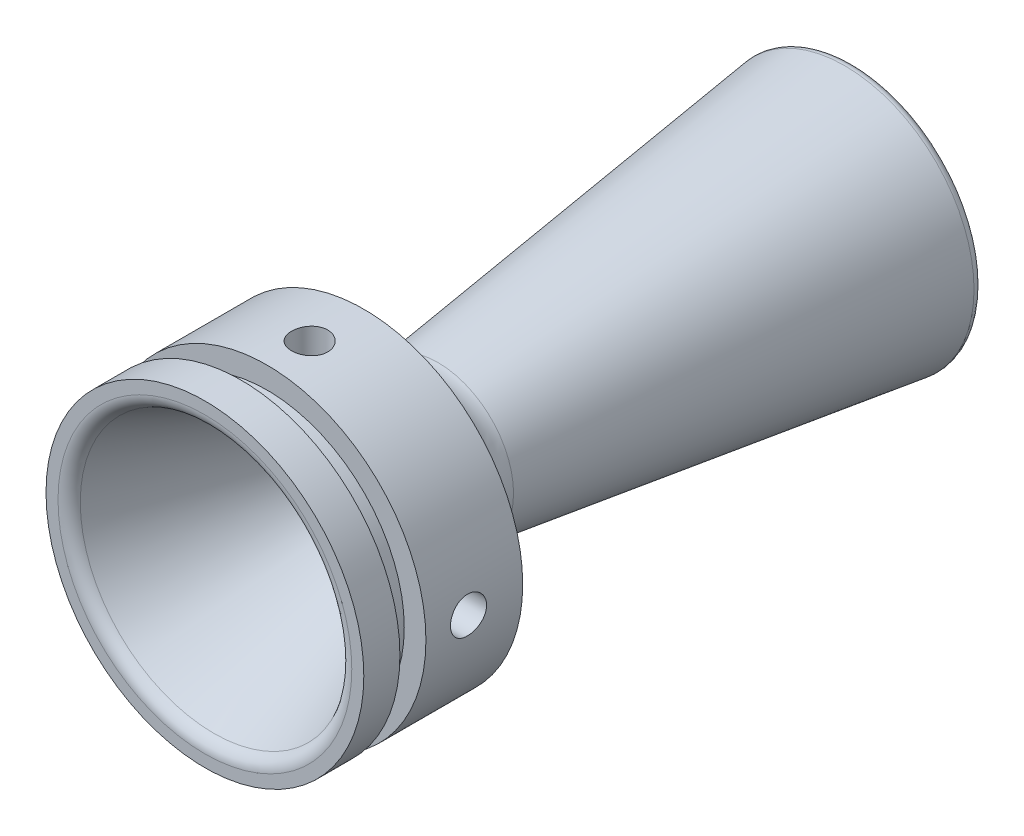
ISO-10303-21;
HEADER;
FILE_DESCRIPTION(('STEP AP214'),'2;1');
FILE_NAME('part.step','',(''),(''),'','','');
FILE_SCHEMA(('AUTOMOTIVE_DESIGN { 1 0 10303 214 1 1 1 1 }'));
ENDSEC;
DATA;
#1=APPLICATION_CONTEXT('core data for automotive mechanical design processes');
#2=APPLICATION_PROTOCOL_DEFINITION('international standard','automotive_design',2000,#1);
#3=PRODUCT_CONTEXT('',#1,'mechanical');
#4=PRODUCT('Part','Part','',(#3));
#5=PRODUCT_RELATED_PRODUCT_CATEGORY('part','',(#4));
#6=PRODUCT_DEFINITION_FORMATION('','',#4);
#7=PRODUCT_DEFINITION_CONTEXT('part definition',#1,'design');
#8=PRODUCT_DEFINITION('design','',#6,#7);
#9=PRODUCT_DEFINITION_SHAPE('','',#8);
#10=(LENGTH_UNIT() NAMED_UNIT(*) SI_UNIT(.MILLI.,.METRE.));
#11=(NAMED_UNIT(*) PLANE_ANGLE_UNIT() SI_UNIT($,.RADIAN.));
#12=(NAMED_UNIT(*) SI_UNIT($,.STERADIAN.) SOLID_ANGLE_UNIT());
#13=UNCERTAINTY_MEASURE_WITH_UNIT(LENGTH_MEASURE(1.E-05),#10,'distance_accuracy_value','');
#14=(GEOMETRIC_REPRESENTATION_CONTEXT(3) GLOBAL_UNCERTAINTY_ASSIGNED_CONTEXT((#13)) GLOBAL_UNIT_ASSIGNED_CONTEXT((#10,
#11,#12)) REPRESENTATION_CONTEXT('',''));
#15=CARTESIAN_POINT('',(0.,0.,0.));
#16=DIRECTION('',(0.,0.,1.));
#17=DIRECTION('',(1.,0.,0.));
#18=AXIS2_PLACEMENT_3D('',#15,#16,#17);
#19=CARTESIAN_POINT('',(0.,0.,41.444538182155));
#20=DIRECTION('',(0.,0.,1.));
#21=DIRECTION('',(1.,0.,0.));
#22=AXIS2_PLACEMENT_3D('',#19,#20,#21);
#23=CONICAL_SURFACE('',#22,19.,0.392699081698717);
#24=CARTESIAN_POINT('',(0.,0.,40.2099050468852));
#25=DIRECTION('',(0.,0.,-1.));
#26=DIRECTION('',(-1.,0.,0.));
#27=AXIS2_PLACEMENT_3D('',#24,#25,#26);
#28=CIRCLE('',#27,18.488598210816);
#29=CARTESIAN_POINT('',(-18.488598210816,0.,40.2099050468852));
#30=VERTEX_POINT('',#29);
#31=EDGE_CURVE('E47',#30,#30,#28,.F.);
#32=ORIENTED_EDGE('',*,*,#31,.T.);
#33=EDGE_LOOP('',(#32));
#34=FACE_BOUND('',#33,.T.);
#35=CARTESIAN_POINT('',(0.,0.,12.7215282083173));
#36=DIRECTION('',(0.,0.,-1.));
#37=DIRECTION('',(-1.,0.,0.));
#38=AXIS2_PLACEMENT_3D('',#35,#36,#37);
#39=CIRCLE('',#38,7.10253971665899);
#40=CARTESIAN_POINT('',(-7.10253971665899,0.,12.7215282083173));
#41=VERTEX_POINT('',#40);
#42=EDGE_CURVE('E128',#41,#41,#39,.T.);
#43=ORIENTED_EDGE('',*,*,#42,.T.);
#44=EDGE_LOOP('',(#43));
#45=FACE_BOUND('',#44,.T.);
#46=ADVANCED_FACE('F40',(#34,#45),#23,.F.);
#47=CARTESIAN_POINT('',(0.,0.,12.4739754336773));
#48=DIRECTION('',(0.,0.,-1.));
#49=DIRECTION('',(-1.,0.,0.));
#50=AXIS2_PLACEMENT_3D('',#47,#48,#49);
#51=CONICAL_SURFACE('',#50,7.,0.130899693899576);
#52=CARTESIAN_POINT('',(0.,0.,-47.4225836603435));
#53=DIRECTION('',(0.,0.,1.));
#54=DIRECTION('',(1.,0.,0.));
#55=AXIS2_PLACEMENT_3D('',#52,#53,#54);
#56=CIRCLE('',#55,14.8855316016189);
#57=CARTESIAN_POINT('',(14.8855316016189,0.,-47.4225836603435));
#58=VERTEX_POINT('',#57);
#59=EDGE_CURVE('E55',#58,#58,#56,.F.);
#60=ORIENTED_EDGE('',*,*,#59,.T.);
#61=EDGE_LOOP('',(#60));
#62=FACE_BOUND('',#61,.T.);
#63=CARTESIAN_POINT('',(0.,0.,12.2083185837322));
#64=DIRECTION('',(0.,0.,1.));
#65=DIRECTION('',(1.,0.,0.));
#66=AXIS2_PLACEMENT_3D('',#63,#64,#65);
#67=CIRCLE('',#66,7.03497438779647);
#68=CARTESIAN_POINT('',(7.03497438779647,0.,12.2083185837322));
#69=VERTEX_POINT('',#68);
#70=EDGE_CURVE('E207',#69,#69,#67,.T.);
#71=ORIENTED_EDGE('',*,*,#70,.T.);
#72=EDGE_LOOP('',(#71));
#73=FACE_BOUND('',#72,.T.);
#74=ADVANCED_FACE('F161',(#62,#73),#51,.F.);
#75=CARTESIAN_POINT('',(-15.,0.,-48.2920574681234));
#76=DIRECTION('',(0.,0.,1.));
#77=DIRECTION('',(1.,0.,0.));
#78=AXIS2_PLACEMENT_3D('',#75,#76,#77);
#79=PLANE('',#78);
#80=CARTESIAN_POINT('',(0.,0.,-48.2920574681234));
#81=DIRECTION('',(0.,0.,1.));
#82=DIRECTION('',(1.,0.,0.));
#83=AXIS2_PLACEMENT_3D('',#80,#81,#82);
#84=CIRCLE('',#83,15.8769764629928);
#85=CARTESIAN_POINT('',(15.8769764629928,0.,-48.2920574681234));
#86=VERTEX_POINT('',#85);
#87=EDGE_CURVE('E60',#86,#86,#84,.T.);
#88=ORIENTED_EDGE('',*,*,#87,.T.);
#89=EDGE_LOOP('',(#88));
#90=FACE_BOUND('',#89,.T.);
#91=CARTESIAN_POINT('',(0.,0.,-48.2920574681234));
#92=DIRECTION('',(0.,0.,1.));
#93=DIRECTION('',(1.,0.,0.));
#94=AXIS2_PLACEMENT_3D('',#91,#92,#93);
#95=CIRCLE('',#94,16.8856054235729);
#96=CARTESIAN_POINT('',(16.8856054235729,0.,-48.2920574681234));
#97=VERTEX_POINT('',#96);
#98=EDGE_CURVE('E63',#97,#97,#95,.F.);
#99=ORIENTED_EDGE('',*,*,#98,.T.);
#100=EDGE_LOOP('',(#99));
#101=FACE_BOUND('',#100,.T.);
#102=ADVANCED_FACE('F166',(#90,#101),#79,.F.);
#103=CARTESIAN_POINT('',(0.,0.,-48.2920574681234));
#104=DIRECTION('',(0.,0.,-1.));
#105=DIRECTION('',(-1.,0.,0.));
#106=AXIS2_PLACEMENT_3D('',#103,#104,#105);
#107=CONICAL_SURFACE('',#106,18.0258868817405,0.130899693899576);
#108=CARTESIAN_POINT('',(0.,0.,-47.1615312759034));
#109=DIRECTION('',(0.,0.,1.));
#110=DIRECTION('',(1.,0.,0.));
#111=AXIS2_PLACEMENT_3D('',#108,#109,#110);
#112=CIRCLE('',#111,17.8770502849467);
#113=CARTESIAN_POINT('',(17.8770502849467,0.,-47.1615312759034));
#114=VERTEX_POINT('',#113);
#115=EDGE_CURVE('E51',#114,#114,#112,.T.);
#116=ORIENTED_EDGE('',*,*,#115,.T.);
#117=EDGE_LOOP('',(#116));
#118=FACE_BOUND('',#117,.T.);
#119=CARTESIAN_POINT('',(0.,0.,9.17449056678364));
#120=DIRECTION('',(0.,0.,-1.));
#121=DIRECTION('',(-1.,0.,0.));
#122=AXIS2_PLACEMENT_3D('',#119,#120,#121);
#123=CIRCLE('',#122,10.4602723052188);
#124=CARTESIAN_POINT('',(-10.4602723052188,0.,9.17449056678364));
#125=VERTEX_POINT('',#124);
#126=EDGE_CURVE('E66',#125,#125,#123,.T.);
#127=ORIENTED_EDGE('',*,*,#126,.T.);
#128=EDGE_LOOP('',(#127));
#129=FACE_BOUND('',#128,.T.);
#130=ADVANCED_FACE('F193',(#118,#129),#107,.T.);
#131=CARTESIAN_POINT('',(0.,0.,12.4739754336773));
#132=DIRECTION('',(0.,0.,1.));
#133=DIRECTION('',(1.,0.,0.));
#134=AXIS2_PLACEMENT_3D('',#131,#132,#133);
#135=CONICAL_SURFACE('',#134,10.0258868817405,1.04361566397622);
#136=CARTESIAN_POINT('',(0.,0.,14.1482660703498));
#137=DIRECTION('',(0.,0.,1.));
#138=DIRECTION('',(1.,0.,0.));
#139=AXIS2_PLACEMENT_3D('',#136,#137,#138);
#140=CIRCLE('',#139,12.9020026559995);
#141=CARTESIAN_POINT('',(12.9020026559995,0.,14.1482660703498));
#142=VERTEX_POINT('',#141);
#143=EDGE_CURVE('E69',#142,#142,#140,.T.);
#144=ORIENTED_EDGE('',*,*,#143,.T.);
#145=EDGE_LOOP('',(#144));
#146=FACE_BOUND('',#145,.T.);
#147=CARTESIAN_POINT('',(0.,0.,19.444538182155));
#148=DIRECTION('',(0.,0.,1.));
#149=DIRECTION('',(1.,0.,0.));
#150=AXIS2_PLACEMENT_3D('',#147,#148,#149);
#151=CIRCLE('',#150,22.);
#152=CARTESIAN_POINT('',(22.,0.,19.444538182155));
#153=VERTEX_POINT('',#152);
#154=EDGE_CURVE('E205',#153,#153,#151,.T.);
#155=ORIENTED_EDGE('',*,*,#154,.F.);
#156=EDGE_LOOP('',(#155));
#157=FACE_BOUND('',#156,.T.);
#158=ADVANCED_FACE('F156',(#146,#157),#135,.T.);
#159=CARTESIAN_POINT('',(0.,0.,0.));
#160=DIRECTION('',(0.,0.,1.));
#161=DIRECTION('',(1.,0.,0.));
#162=AXIS2_PLACEMENT_3D('',#159,#160,#161);
#163=CYLINDRICAL_SURFACE('',#162,22.);
#164=CARTESIAN_POINT('',(-21.8574929943944,-2.50000000000023,26.944538182155));
#165=CARTESIAN_POINT('',(-21.8574948404449,-2.49999399345875,26.8045993506711));
#166=CARTESIAN_POINT('',(-21.8588513925992,-2.48821066246475,26.6645706120558));
#167=CARTESIAN_POINT('',(-21.864129607938,-2.44138692557921,26.3884030757904));
#168=CARTESIAN_POINT('',(-21.8680540220547,-2.40632157723589,26.2522686134783));
#169=CARTESIAN_POINT('',(-21.8780178338977,-2.31397472598975,25.9879284868806));
#170=CARTESIAN_POINT('',(-21.8840558698382,-2.2567075249758,25.8597177798252));
#171=CARTESIAN_POINT('',(-21.8975649360899,-2.12161174348122,25.6147529474055));
#172=CARTESIAN_POINT('',(-21.9050357023158,-2.0437869512451,25.4979967167015));
#173=CARTESIAN_POINT('',(-21.9206073815676,-1.86939694811628,25.2786863408821));
#174=CARTESIAN_POINT('',(-21.928710779348,-1.77275535863444,25.1761931001405));
#175=CARTESIAN_POINT('',(-21.9446122373921,-1.56363902487904,24.988843452653));
#176=CARTESIAN_POINT('',(-21.9524102830485,-1.45116352433197,24.9039878888132));
#177=CARTESIAN_POINT('',(-21.9668474759571,-1.21319341197233,24.7541072352822));
#178=CARTESIAN_POINT('',(-21.9734834111379,-1.08766419785685,24.6891367490087));
#179=CARTESIAN_POINT('',(-21.9848214978184,-0.827389205168524,24.5812200455874));
#180=CARTESIAN_POINT('',(-21.9895237091853,-0.692643712077801,24.53827314659));
#181=CARTESIAN_POINT('',(-21.9964470600792,-0.418381005212754,24.4758032739701));
#182=CARTESIAN_POINT('',(-21.998678870315,-0.278887017845019,24.4561795304337));
#183=CARTESIAN_POINT('',(-22.0004463272971,0.00143099383586754,24.4406009537405));
#184=CARTESIAN_POINT('',(-21.9999820627129,0.142254974255643,24.4446453421775));
#185=CARTESIAN_POINT('',(-21.9964183604366,0.420550630608937,24.4762069673103));
#186=CARTESIAN_POINT('',(-21.9933310886017,0.558034773962368,24.503615838368));
#187=CARTESIAN_POINT('',(-21.9848820663586,0.826439024849395,24.5809592718644));
#188=CARTESIAN_POINT('',(-21.979520279177,0.957359026218432,24.6308941984957));
#189=CARTESIAN_POINT('',(-21.9671038779958,1.20925707942373,24.7519892325637));
#190=CARTESIAN_POINT('',(-21.9600454901808,1.33021214895033,24.8231967444282));
#191=CARTESIAN_POINT('',(-21.9450267053126,1.55849612951545,24.9847811792607));
#192=CARTESIAN_POINT('',(-21.9370662740678,1.665824523714,25.0751588289772));
#193=CARTESIAN_POINT('',(-21.9210823776639,1.86444422114993,25.2731262109408));
#194=CARTESIAN_POINT('',(-21.9130588104756,1.95564149146887,25.3808103037116));
#195=CARTESIAN_POINT('',(-21.8978975645861,2.11868072453664,25.6100082252495));
#196=CARTESIAN_POINT('',(-21.8907598878654,2.1905226440133,25.7315220849345));
#197=CARTESIAN_POINT('',(-21.8781783612793,2.31281440255516,25.9850084349154));
#198=CARTESIAN_POINT('',(-21.8727350420934,2.36325754122656,26.1169841857123));
#199=CARTESIAN_POINT('',(-21.864169235206,2.44124079586617,26.3876082570546));
#200=CARTESIAN_POINT('',(-21.8610466556216,2.46878181857982,26.5262563131986));
#201=CARTESIAN_POINT('',(-21.8574922979508,2.50005624703237,26.8054611995133));
#202=CARTESIAN_POINT('',(-21.8570456061295,2.50392160890486,26.9460030665531));
#203=CARTESIAN_POINT('',(-21.8588542040416,2.48808238007229,27.2257324105612));
#204=CARTESIAN_POINT('',(-21.8611094463909,2.46837820270987,27.3649199112382));
#205=CARTESIAN_POINT('',(-21.8680542187961,2.40606999333129,27.6375992785569));
#206=CARTESIAN_POINT('',(-21.8727370324259,2.36352913269651,27.7711057658216));
#207=CARTESIAN_POINT('',(-21.8840038747199,2.25681990269816,28.0290893261476));
#208=CARTESIAN_POINT('',(-21.8905879590963,2.19265089956366,28.1535661344816));
#209=CARTESIAN_POINT('',(-21.9049514016359,2.04417952250898,28.3905560578221));
#210=CARTESIAN_POINT('',(-21.9127358698692,1.9597901768422,28.5030143714151));
#211=CARTESIAN_POINT('',(-21.9286066123765,1.77339738422291,28.7122175265375));
#212=CARTESIAN_POINT('',(-21.9366928963156,1.67139337281517,28.8089618643259));
#213=CARTESIAN_POINT('',(-21.9523015976726,1.4520922366466,28.9844503034995));
#214=CARTESIAN_POINT('',(-21.9598211974455,1.33472573746585,29.0631079963449));
#215=CARTESIAN_POINT('',(-21.9734077022891,1.08837113446317,29.1995940434525));
#216=CARTESIAN_POINT('',(-21.9794746322096,0.959383229491211,29.2574227540279));
#217=CARTESIAN_POINT('',(-21.9894596182653,0.693741398540139,29.3504648026428));
#218=CARTESIAN_POINT('',(-21.9933825191578,0.557105531606551,29.3857291593189));
#219=CARTESIAN_POINT('',(-21.9986574531947,0.279804901301133,29.4328077157782));
#220=CARTESIAN_POINT('',(-22.0000095811711,0.139140286737976,29.4446227805708));
#221=CARTESIAN_POINT('',(-21.9999903687085,-0.141378798478945,29.4444531442793));
#222=CARTESIAN_POINT('',(-21.9986343240669,-0.281233370030648,29.4326021096879));
#223=CARTESIAN_POINT('',(-21.9933814076815,-0.556950296258434,29.3857184301088));
#224=CARTESIAN_POINT('',(-21.9894845357215,-0.692812650594941,29.3506857831492));
#225=CARTESIAN_POINT('',(-21.9795861605335,-0.95667881692291,29.2584729850131));
#226=CARTESIAN_POINT('',(-21.9735851539652,-1.08468447503711,29.2012980599649));
#227=CARTESIAN_POINT('',(-21.9601451371913,-1.32930448780824,29.0664376068342));
#228=CARTESIAN_POINT('',(-21.9527061220459,-1.4459188033324,28.9887520082946));
#229=CARTESIAN_POINT('',(-21.9371717011071,-1.66513009568999,28.814577199868));
#230=CARTESIAN_POINT('',(-21.9290729575937,-1.76764770962287,28.717988399767));
#231=CARTESIAN_POINT('',(-21.913159404769,-1.9550746138903,28.5089523269637));
#232=CARTESIAN_POINT('',(-21.9053446635564,-2.03997970373623,28.3965012819229));
#233=CARTESIAN_POINT('',(-21.8908571504647,-2.18999746444617,28.1585258330524));
#234=CARTESIAN_POINT('',(-21.8841881276822,-2.25504567813444,28.0329605929084));
#235=CARTESIAN_POINT('',(-21.872791323487,-2.36304368993383,27.7726884049613));
#236=CARTESIAN_POINT('',(-21.8680613941046,-2.40601795319341,27.637991766051));
#237=CARTESIAN_POINT('',(-21.8622482818917,-2.45815239629055,27.4095608694101));
#238=CARTESIAN_POINT('',(-21.8604737120552,-2.47382322658507,27.3172774146803));
#239=CARTESIAN_POINT('',(-21.8580954549332,-2.49474900486783,27.1315220783653));
#240=CARTESIAN_POINT('',(-21.8574917607989,-2.50000401378133,27.0380502037346));
#241=CARTESIAN_POINT('',(-21.8574929943944,-2.50000000000023,26.944538182155));
#242=B_SPLINE_CURVE_WITH_KNOTS('',3,(#164,#165,#166,#167,#168,#169,#170,#171,#172,#173,#174,
#175,#176,#177,#178,#179,#180,#181,#182,#183,#184,#185,#186,#187,#188,#189,#190,#191,#192,#193,
#194,#195,#196,#197,#198,#199,#200,#201,#202,#203,#204,#205,#206,#207,#208,#209,#210,#211,#212,
#213,#214,#215,#216,#217,#218,#219,#220,#221,#222,#223,#224,#225,#226,#227,#228,#229,#230,#231,
#232,#233,#234,#235,#236,#237,#238,#239,#240,#241),.UNSPECIFIED.,.T.,.F.,(4,2,2,2,2,2,2,2,2,2,2,
2,2,2,2,2,2,2,2,2,2,2,2,2,2,2,2,2,2,2,2,2,2,2,2,2,2,2,4),(0.,0.419474942050651,
0.839400001964435,1.25905500472157,1.67863272954998,2.09995045417845,2.52128830899466,
2.94377296547458,3.36624454105267,3.78688407436451,4.20750977360757,4.62619513856898,
5.04488727291757,5.46451948216004,5.88416760269032,6.30618666610461,6.72820667300605,
7.15035872559825,7.57249406346057,7.99227447605665,8.41204752700673,8.83066533056146,
9.24929540196869,9.66975947150893,10.0902370171605,10.512683476394,10.93512270866,
11.3566033870119,11.7780685172817,12.1971599385153,12.6162513953965,13.0352439964974,
13.4542380369162,13.8755020164552,14.2968663498818,14.7195842705661,15.1418326652607,
15.4221421323578,15.7024499598362),.UNSPECIFIED.);
#243=CARTESIAN_POINT('',(-21.8574929943944,-2.50000000000023,26.944538182155));
#244=VERTEX_POINT('',#243);
#245=EDGE_CURVE('E72',#244,#244,#242,.T.);
#246=ORIENTED_EDGE('',*,*,#245,.T.);
#247=EDGE_LOOP('',(#246));
#248=FACE_BOUND('',#247,.T.);
#249=CARTESIAN_POINT('',(2.50000000000015,-21.8574929943944,26.944538182155));
#250=CARTESIAN_POINT('',(2.49999399345868,-21.8574948404449,26.8045993506711));
#251=CARTESIAN_POINT('',(2.48821066246468,-21.8588513925992,26.6645706120558));
#252=CARTESIAN_POINT('',(2.44138692557914,-21.864129607938,26.3884030757904));
#253=CARTESIAN_POINT('',(2.40632157723582,-21.8680540220547,26.2522686134783));
#254=CARTESIAN_POINT('',(2.31397472598968,-21.8780178338977,25.9879284868806));
#255=CARTESIAN_POINT('',(2.25670752497572,-21.8840558698382,25.8597177798252));
#256=CARTESIAN_POINT('',(2.12161174348115,-21.89756493609,25.6147529474055));
#257=CARTESIAN_POINT('',(2.04378695124502,-21.9050357023158,25.4979967167015));
#258=CARTESIAN_POINT('',(1.8693969481162,-21.9206073815676,25.2786863408821));
#259=CARTESIAN_POINT('',(1.77275535863437,-21.928710779348,25.1761931001405));
#260=CARTESIAN_POINT('',(1.56363902487896,-21.9446122373921,24.988843452653));
#261=CARTESIAN_POINT('',(1.45116352433189,-21.9524102830485,24.9039878888132));
#262=CARTESIAN_POINT('',(1.21319341197225,-21.9668474759571,24.7541072352822));
#263=CARTESIAN_POINT('',(1.08766419785677,-21.9734834111379,24.6891367490087));
#264=CARTESIAN_POINT('',(0.827389205168447,-21.9848214978184,24.5812200455874));
#265=CARTESIAN_POINT('',(0.692643712077725,-21.9895237091853,24.53827314659));
#266=CARTESIAN_POINT('',(0.418381005212677,-21.9964470600792,24.4758032739701));
#267=CARTESIAN_POINT('',(0.278887017844942,-21.998678870315,24.4561795304337));
#268=CARTESIAN_POINT('',(-0.00143099383594379,-22.0004463272971,24.4406009537405));
#269=CARTESIAN_POINT('',(-0.142254974255719,-21.9999820627129,24.4446453421775));
#270=CARTESIAN_POINT('',(-0.420550630609013,-21.9964183604366,24.4762069673103));
#271=CARTESIAN_POINT('',(-0.558034773962445,-21.9933310886017,24.503615838368));
#272=CARTESIAN_POINT('',(-0.826439024849473,-21.9848820663586,24.5809592718644));
#273=CARTESIAN_POINT('',(-0.957359026218508,-21.979520279177,24.6308941984957));
#274=CARTESIAN_POINT('',(-1.20925707942381,-21.9671038779958,24.7519892325637));
#275=CARTESIAN_POINT('',(-1.3302121489504,-21.9600454901808,24.8231967444282));
#276=CARTESIAN_POINT('',(-1.55849612951553,-21.9450267053126,24.9847811792607));
#277=CARTESIAN_POINT('',(-1.66582452371408,-21.9370662740678,25.0751588289772));
#278=CARTESIAN_POINT('',(-1.86444422115,-21.9210823776639,25.2731262109408));
#279=CARTESIAN_POINT('',(-1.95564149146895,-21.9130588104756,25.3808103037116));
#280=CARTESIAN_POINT('',(-2.11868072453671,-21.8978975645861,25.6100082252495));
#281=CARTESIAN_POINT('',(-2.19052264401337,-21.8907598878654,25.7315220849345));
#282=CARTESIAN_POINT('',(-2.31281440255523,-21.8781783612793,25.9850084349154));
#283=CARTESIAN_POINT('',(-2.36325754122664,-21.8727350420934,26.1169841857123));
#284=CARTESIAN_POINT('',(-2.44124079586624,-21.8641692352059,26.3876082570546));
#285=CARTESIAN_POINT('',(-2.4687818185799,-21.8610466556216,26.5262563131986));
#286=CARTESIAN_POINT('',(-2.50005624703245,-21.8574922979508,26.8054611995133));
#287=CARTESIAN_POINT('',(-2.50392160890494,-21.8570456061295,26.9460030665531));
#288=CARTESIAN_POINT('',(-2.48808238007237,-21.8588542040416,27.2257324105612));
#289=CARTESIAN_POINT('',(-2.46837820270995,-21.8611094463909,27.3649199112382));
#290=CARTESIAN_POINT('',(-2.40606999333136,-21.8680542187961,27.6375992785569));
#291=CARTESIAN_POINT('',(-2.36352913269659,-21.8727370324259,27.7711057658216));
#292=CARTESIAN_POINT('',(-2.25681990269824,-21.8840038747199,28.0290893261476));
#293=CARTESIAN_POINT('',(-2.19265089956374,-21.8905879590963,28.1535661344816));
#294=CARTESIAN_POINT('',(-2.04417952250905,-21.9049514016359,28.3905560578221));
#295=CARTESIAN_POINT('',(-1.95979017684228,-21.9127358698691,28.5030143714151));
#296=CARTESIAN_POINT('',(-1.77339738422299,-21.9286066123765,28.7122175265375));
#297=CARTESIAN_POINT('',(-1.67139337281524,-21.9366928963156,28.8089618643259));
#298=CARTESIAN_POINT('',(-1.45209223664668,-21.9523015976726,28.9844503034995));
#299=CARTESIAN_POINT('',(-1.33472573746593,-21.9598211974455,29.0631079963449));
#300=CARTESIAN_POINT('',(-1.08837113446325,-21.9734077022891,29.1995940434525));
#301=CARTESIAN_POINT('',(-0.959383229491288,-21.9794746322096,29.2574227540279));
#302=CARTESIAN_POINT('',(-0.693741398540216,-21.9894596182653,29.3504648026428));
#303=CARTESIAN_POINT('',(-0.557105531606628,-21.9933825191578,29.3857291593189));
#304=CARTESIAN_POINT('',(-0.27980490130121,-21.9986574531947,29.4328077157782));
#305=CARTESIAN_POINT('',(-0.139140286738053,-22.0000095811711,29.4446227805708));
#306=CARTESIAN_POINT('',(0.141378798478868,-21.9999903687085,29.4444531442793));
#307=CARTESIAN_POINT('',(0.281233370030571,-21.9986343240669,29.4326021096879));
#308=CARTESIAN_POINT('',(0.556950296258358,-21.9933814076815,29.3857184301088));
#309=CARTESIAN_POINT('',(0.692812650594865,-21.9894845357215,29.3506857831492));
#310=CARTESIAN_POINT('',(0.956678816922833,-21.9795861605335,29.2584729850131));
#311=CARTESIAN_POINT('',(1.08468447503703,-21.9735851539652,29.2012980599649));
#312=CARTESIAN_POINT('',(1.32930448780816,-21.9601451371913,29.0664376068342));
#313=CARTESIAN_POINT('',(1.44591880333232,-21.9527061220459,28.9887520082946));
#314=CARTESIAN_POINT('',(1.66513009568991,-21.9371717011071,28.814577199868));
#315=CARTESIAN_POINT('',(1.76764770962279,-21.9290729575937,28.717988399767));
#316=CARTESIAN_POINT('',(1.95507461389022,-21.913159404769,28.5089523269637));
#317=CARTESIAN_POINT('',(2.03997970373615,-21.9053446635565,28.3965012819229));
#318=CARTESIAN_POINT('',(2.18999746444609,-21.8908571504647,28.1585258330524));
#319=CARTESIAN_POINT('',(2.25504567813436,-21.8841881276823,28.0329605929084));
#320=CARTESIAN_POINT('',(2.36304368993375,-21.872791323487,27.7726884049613));
#321=CARTESIAN_POINT('',(2.40601795319333,-21.8680613941046,27.637991766051));
#322=CARTESIAN_POINT('',(2.45815239629047,-21.8622482818917,27.4095608694101));
#323=CARTESIAN_POINT('',(2.47382322658499,-21.8604737120552,27.3172774146803));
#324=CARTESIAN_POINT('',(2.49474900486776,-21.8580954549332,27.1315220783653));
#325=CARTESIAN_POINT('',(2.50000401378125,-21.8574917607989,27.0380502037346));
#326=CARTESIAN_POINT('',(2.50000000000015,-21.8574929943944,26.944538182155));
#327=B_SPLINE_CURVE_WITH_KNOTS('',3,(#249,#250,#251,#252,#253,#254,#255,#256,#257,#258,#259,
#260,#261,#262,#263,#264,#265,#266,#267,#268,#269,#270,#271,#272,#273,#274,#275,#276,#277,#278,
#279,#280,#281,#282,#283,#284,#285,#286,#287,#288,#289,#290,#291,#292,#293,#294,#295,#296,#297,
#298,#299,#300,#301,#302,#303,#304,#305,#306,#307,#308,#309,#310,#311,#312,#313,#314,#315,#316,
#317,#318,#319,#320,#321,#322,#323,#324,#325,#326),.UNSPECIFIED.,.T.,.F.,(4,2,2,2,2,2,2,2,2,2,2,
2,2,2,2,2,2,2,2,2,2,2,2,2,2,2,2,2,2,2,2,2,2,2,2,2,2,2,4),(0.,0.419474942050651,
0.839400001964435,1.25905500472157,1.67863272954998,2.09995045417845,2.52128830899466,
2.94377296547458,3.36624454105267,3.78688407436451,4.20750977360757,4.62619513856898,
5.04488727291757,5.46451948216004,5.88416760269032,6.30618666610461,6.72820667300604,
7.15035872559824,7.57249406346057,7.99227447605665,8.41204752700673,8.83066533056146,
9.24929540196869,9.66975947150892,10.0902370171605,10.512683476394,10.93512270866,
11.3566033870119,11.7780685172817,12.1971599385153,12.6162513953965,13.0352439964974,
13.4542380369162,13.8755020164552,14.2968663498818,14.719584270566,15.1418326652607,
15.4221421323578,15.7024499598362),.UNSPECIFIED.);
#328=CARTESIAN_POINT('',(2.50000000000015,-21.8574929943944,26.944538182155));
#329=VERTEX_POINT('',#328);
#330=EDGE_CURVE('E80',#329,#329,#327,.T.);
#331=ORIENTED_EDGE('',*,*,#330,.T.);
#332=EDGE_LOOP('',(#331));
#333=FACE_BOUND('',#332,.T.);
#334=CARTESIAN_POINT('',(22.,0.,24.444538182155));
#335=CARTESIAN_POINT('',(21.9999981975919,-0.139942120492704,24.4445441857788));
#336=CARTESIAN_POINT('',(21.9986505974093,-0.279974138126226,24.4563280519622));
#337=CARTESIAN_POINT('',(21.9934043565321,-0.556148487010532,24.5031541078237));
#338=CARTESIAN_POINT('',(21.9895029814005,-0.692286485506178,24.5382212284647));
#339=CARTESIAN_POINT('',(21.9795891281265,-0.956634090603118,24.6305732638718));
#340=CARTESIAN_POINT('',(21.9735780011658,-1.084848710035,24.6878439609011));
#341=CARTESIAN_POINT('',(21.9601149294206,-1.32982010232701,24.8229479761752));
#342=CARTESIAN_POINT('',(21.9526632507436,-1.44657898536496,24.9007774976395));
#343=CARTESIAN_POINT('',(21.9371141432161,-1.66588638440345,25.0751722856485));
#344=CARTESIAN_POINT('',(21.9290141980917,-1.76837483182788,25.171812873508));
#345=CARTESIAN_POINT('',(21.9131020063762,-1.95571522291826,25.3809251889752));
#346=CARTESIAN_POINT('',(21.9052897737902,-2.04056630896765,25.4933976859636));
#347=CARTESIAN_POINT('',(21.8908124112617,-2.19044226566766,25.7313651486069));
#348=CARTESIAN_POINT('',(21.8841505100655,-2.25541171448298,25.8568952331857));
#349=CARTESIAN_POINT('',(21.8727604817688,-2.36332625999539,26.1171721172543));
#350=CARTESIAN_POINT('',(21.8680322937344,-2.40627205069835,26.2519186261659));
#351=CARTESIAN_POINT('',(21.8610685551783,-2.46873962870037,26.5261845165391));
#352=CARTESIAN_POINT('',(21.8588222953962,-2.48836208177004,26.6656806935126));
#353=CARTESIAN_POINT('',(21.8570437801561,-2.50393731881292,26.9460029978343));
#354=CARTESIAN_POINT('',(21.857511433825,-2.49989089531933,27.0868290804941));
#355=CARTESIAN_POINT('',(21.8610981119458,-2.46832603397922,27.365115800227));
#356=CARTESIAN_POINT('',(21.8642046638515,-2.44091801082985,27.5025891446405));
#357=CARTESIAN_POINT('',(21.8726996480669,-2.36358001078347,27.770972235963));
#358=CARTESIAN_POINT('',(21.8780881192308,-2.31364965039851,27.9018818710697));
#359=CARTESIAN_POINT('',(21.8905540526255,-2.19256410016401,28.153767302926));
#360=CARTESIAN_POINT('',(21.8976353640563,-2.12136044532622,28.2747196034879));
#361=CARTESIAN_POINT('',(21.9126859988771,-1.95978425819468,28.5029996790514));
#362=CARTESIAN_POINT('',(21.9206553558465,-1.86941100093277,28.6103269385271));
#363=CARTESIAN_POINT('',(21.9366396636115,-1.67144675226655,28.808951544202));
#364=CARTESIAN_POINT('',(21.9446546152082,-1.56376049910153,28.9001539721799));
#365=CARTESIAN_POINT('',(21.9597843300299,-1.33455641116137,29.063202584714));
#366=CARTESIAN_POINT('',(21.9668990917444,-1.21303855318131,29.1350487367959));
#367=CARTESIAN_POINT('',(21.9794301549947,-0.959551083313942,29.2573435471591));
#368=CARTESIAN_POINT('',(21.9848460278232,-0.827578843815121,29.3077868056432));
#369=CARTESIAN_POINT('',(21.9933650035466,-0.556962410192956,29.3857713742308));
#370=CARTESIAN_POINT('',(21.9964681958351,-0.418318474175985,29.4133135695502));
#371=CARTESIAN_POINT('',(22.0000006162529,-0.139115562473795,29.4445924251968));
#372=CARTESIAN_POINT('',(22.0004445432446,0.00142857438073979,29.4484599478665));
#373=CARTESIAN_POINT('',(21.9986479703045,0.281162975755555,29.4326242305211));
#374=CARTESIAN_POINT('',(21.9964075174271,0.420353263964264,29.4129214036694));
#375=CARTESIAN_POINT('',(21.9895031856979,0.693046793171793,29.3506129252209));
#376=CARTESIAN_POINT('',(21.9848458531969,0.826564347682261,29.3080691298741));
#377=CARTESIAN_POINT('',(21.9736296697858,1.08456874561861,29.2013503277328));
#378=CARTESIAN_POINT('',(21.9670707646913,1.20905533158528,29.1371747045418));
#379=CARTESIAN_POINT('',(21.9527471473237,1.44605201209458,28.9886935302187));
#380=CARTESIAN_POINT('',(21.9449773761005,1.55850835984385,28.9043026878536));
#381=CARTESIAN_POINT('',(21.9291185390767,1.76770685232021,28.7179080649365));
#382=CARTESIAN_POINT('',(21.9210294628737,1.86444848456352,28.6159037102015));
#383=CARTESIAN_POINT('',(21.9053988844009,2.03993094133513,28.3966037350238));
#384=CARTESIAN_POINT('',(21.897860121097,2.11858542899803,28.2792388051536));
#385=CARTESIAN_POINT('',(21.8842272488579,2.25506585466954,28.032888208424));
#386=CARTESIAN_POINT('',(21.8781331152983,2.31289214771193,27.9039027396933));
#387=CARTESIAN_POINT('',(21.8680974959171,2.40593262677908,27.6382594809815));
#388=CARTESIAN_POINT('',(21.8641512558184,2.44119678383576,27.5016193803227));
#389=CARTESIAN_POINT('',(21.8588440977794,2.48827350695182,27.2243098099821));
#390=CARTESIAN_POINT('',(21.8574830819732,2.50008696076006,27.0836404930346));
#391=CARTESIAN_POINT('',(21.8575029608798,2.4999125682507,26.8031240664231));
#392=CARTESIAN_POINT('',(21.8588682317912,2.48806034520334,26.6632768517682));
#393=CARTESIAN_POINT('',(21.8641533983156,2.44117687417044,26.3875749393215));
#394=CARTESIAN_POINT('',(21.8680732955693,2.40614561129916,26.2517202440938));
#395=CARTESIAN_POINT('',(21.8780214521343,2.31393853334814,25.9878696340495));
#396=CARTESIAN_POINT('',(21.8840492043727,2.25676804380298,25.8598718378475));
#397=CARTESIAN_POINT('',(21.8975348313535,2.12191890001939,25.6152657020477));
#398=CARTESIAN_POINT('',(21.9049927116226,2.04424016652735,25.4986574064668));
#399=CARTESIAN_POINT('',(21.920549528211,1.87007297620061,25.2794459241543));
#400=CARTESIAN_POINT('',(21.92865176664,1.77348335456731,25.176923344949));
#401=CARTESIAN_POINT('',(21.944554677904,1.56444358645355,24.9894868059735));
#402=CARTESIAN_POINT('',(21.9523552786678,1.45198967894404,24.9045770335897));
#403=CARTESIAN_POINT('',(21.9668026825691,1.21401183088061,24.7545541546959));
#404=CARTESIAN_POINT('',(21.9734457481365,1.08844757147553,24.6895046846524));
#405=CARTESIAN_POINT('',(21.9847906665335,0.828177449520047,24.5815040534795));
#406=CARTESIAN_POINT('',(21.9894946659339,0.693481888903993,24.5385284432648));
#407=CARTESIAN_POINT('',(21.9952742327682,0.46504739936882,24.4863902593028));
#408=CARTESIAN_POINT('',(21.9970379412664,0.37275900968676,24.4707177451453));
#409=CARTESIAN_POINT('',(21.9994014237902,0.186993790422357,24.4497897303626));
#410=CARTESIAN_POINT('',(22.0000012044675,0.0935169676348403,24.4445341702058));
#411=CARTESIAN_POINT('',(22.,0.,24.444538182155));
#412=B_SPLINE_CURVE_WITH_KNOTS('',3,(#334,#335,#336,#337,#338,#339,#340,#341,#342,#343,#344,
#345,#346,#347,#348,#349,#350,#351,#352,#353,#354,#355,#356,#357,#358,#359,#360,#361,#362,#363,
#364,#365,#366,#367,#368,#369,#370,#371,#372,#373,#374,#375,#376,#377,#378,#379,#380,#381,#382,
#383,#384,#385,#386,#387,#388,#389,#390,#391,#392,#393,#394,#395,#396,#397,#398,#399,#400,#401,
#402,#403,#404,#405,#406,#407,#408,#409,#410,#411),.UNSPECIFIED.,.T.,.F.,(4,2,2,2,2,2,2,2,2,2,2,
2,2,2,2,2,2,2,2,2,2,2,2,2,2,2,2,2,2,2,2,2,2,2,2,2,2,2,4),(0.,0.419484822149135,
0.839419541148179,1.25908580401208,1.67867461750185,2.09997941147311,2.5213046865971,
2.94379396376735,3.3662699267073,3.78691574360225,4.20754747559246,4.62620211598883,
5.04486388508897,5.46448682171935,5.88412563074592,6.30615785615299,6.72819078960325,
7.15033013572643,7.5724531637517,7.99224077372736,8.41202102537511,8.83067015104128,
9.24933120707243,9.66979077675304,10.0902640555888,10.5127045758307,10.9351378948842,
11.3566323321255,11.7781108129862,12.1971808171325,12.616251090409,13.0352206199537,
13.4541917686199,13.8754686843874,14.2968456428381,14.7195589420158,15.141803027316,
15.4221272970131,15.7024499646853),.UNSPECIFIED.);
#413=CARTESIAN_POINT('',(22.,0.,24.444538182155));
#414=VERTEX_POINT('',#413);
#415=EDGE_CURVE('E116',#414,#414,#412,.T.);
#416=ORIENTED_EDGE('',*,*,#415,.T.);
#417=EDGE_LOOP('',(#416));
#418=FACE_BOUND('',#417,.T.);
#419=CARTESIAN_POINT('',(-2.50000000000015,21.8574929943944,26.944538182155));
#420=CARTESIAN_POINT('',(-2.49999399345868,21.8574948404449,26.8045993506711));
#421=CARTESIAN_POINT('',(-2.48821066246468,21.8588513925992,26.6645706120558));
#422=CARTESIAN_POINT('',(-2.44138692557914,21.864129607938,26.3884030757904));
#423=CARTESIAN_POINT('',(-2.40632157723582,21.8680540220547,26.2522686134783));
#424=CARTESIAN_POINT('',(-2.31397472598968,21.8780178338977,25.9879284868806));
#425=CARTESIAN_POINT('',(-2.25670752497572,21.8840558698382,25.8597177798252));
#426=CARTESIAN_POINT('',(-2.12161174348115,21.89756493609,25.6147529474055));
#427=CARTESIAN_POINT('',(-2.04378695124502,21.9050357023158,25.4979967167015));
#428=CARTESIAN_POINT('',(-1.8693969481162,21.9206073815676,25.2786863408821));
#429=CARTESIAN_POINT('',(-1.77275535863437,21.928710779348,25.1761931001405));
#430=CARTESIAN_POINT('',(-1.56363902487896,21.9446122373921,24.988843452653));
#431=CARTESIAN_POINT('',(-1.45116352433189,21.9524102830485,24.9039878888132));
#432=CARTESIAN_POINT('',(-1.21319341197225,21.9668474759571,24.7541072352822));
#433=CARTESIAN_POINT('',(-1.08766419785677,21.9734834111379,24.6891367490087));
#434=CARTESIAN_POINT('',(-0.827389205168447,21.9848214978184,24.5812200455874));
#435=CARTESIAN_POINT('',(-0.692643712077725,21.9895237091853,24.53827314659));
#436=CARTESIAN_POINT('',(-0.418381005212677,21.9964470600792,24.4758032739701));
#437=CARTESIAN_POINT('',(-0.278887017844942,21.998678870315,24.4561795304337));
#438=CARTESIAN_POINT('',(0.00143099383594379,22.0004463272971,24.4406009537405));
#439=CARTESIAN_POINT('',(0.142254974255719,21.9999820627129,24.4446453421775));
#440=CARTESIAN_POINT('',(0.420550630609013,21.9964183604366,24.4762069673103));
#441=CARTESIAN_POINT('',(0.558034773962445,21.9933310886017,24.503615838368));
#442=CARTESIAN_POINT('',(0.826439024849473,21.9848820663586,24.5809592718644));
#443=CARTESIAN_POINT('',(0.957359026218508,21.979520279177,24.6308941984957));
#444=CARTESIAN_POINT('',(1.20925707942381,21.9671038779958,24.7519892325637));
#445=CARTESIAN_POINT('',(1.3302121489504,21.9600454901808,24.8231967444282));
#446=CARTESIAN_POINT('',(1.55849612951553,21.9450267053126,24.9847811792607));
#447=CARTESIAN_POINT('',(1.66582452371408,21.9370662740678,25.0751588289772));
#448=CARTESIAN_POINT('',(1.86444422115,21.9210823776639,25.2731262109408));
#449=CARTESIAN_POINT('',(1.95564149146895,21.9130588104756,25.3808103037116));
#450=CARTESIAN_POINT('',(2.11868072453671,21.8978975645861,25.6100082252495));
#451=CARTESIAN_POINT('',(2.19052264401337,21.8907598878654,25.7315220849345));
#452=CARTESIAN_POINT('',(2.31281440255523,21.8781783612793,25.9850084349154));
#453=CARTESIAN_POINT('',(2.36325754122664,21.8727350420934,26.1169841857123));
#454=CARTESIAN_POINT('',(2.44124079586624,21.8641692352059,26.3876082570546));
#455=CARTESIAN_POINT('',(2.4687818185799,21.8610466556216,26.5262563131986));
#456=CARTESIAN_POINT('',(2.50005624703245,21.8574922979508,26.8054611995133));
#457=CARTESIAN_POINT('',(2.50392160890494,21.8570456061295,26.9460030665531));
#458=CARTESIAN_POINT('',(2.48808238007237,21.8588542040416,27.2257324105612));
#459=CARTESIAN_POINT('',(2.46837820270995,21.8611094463909,27.3649199112382));
#460=CARTESIAN_POINT('',(2.40606999333136,21.8680542187961,27.6375992785569));
#461=CARTESIAN_POINT('',(2.36352913269659,21.8727370324259,27.7711057658216));
#462=CARTESIAN_POINT('',(2.25681990269824,21.8840038747199,28.0290893261476));
#463=CARTESIAN_POINT('',(2.19265089956374,21.8905879590963,28.1535661344816));
#464=CARTESIAN_POINT('',(2.04417952250905,21.9049514016359,28.3905560578221));
#465=CARTESIAN_POINT('',(1.95979017684228,21.9127358698691,28.5030143714151));
#466=CARTESIAN_POINT('',(1.77339738422299,21.9286066123765,28.7122175265375));
#467=CARTESIAN_POINT('',(1.67139337281524,21.9366928963156,28.8089618643259));
#468=CARTESIAN_POINT('',(1.45209223664668,21.9523015976726,28.9844503034995));
#469=CARTESIAN_POINT('',(1.33472573746593,21.9598211974455,29.0631079963449));
#470=CARTESIAN_POINT('',(1.08837113446325,21.9734077022891,29.1995940434525));
#471=CARTESIAN_POINT('',(0.959383229491288,21.9794746322096,29.2574227540279));
#472=CARTESIAN_POINT('',(0.693741398540216,21.9894596182653,29.3504648026428));
#473=CARTESIAN_POINT('',(0.557105531606628,21.9933825191578,29.3857291593189));
#474=CARTESIAN_POINT('',(0.27980490130121,21.9986574531947,29.4328077157782));
#475=CARTESIAN_POINT('',(0.139140286738053,22.0000095811711,29.4446227805708));
#476=CARTESIAN_POINT('',(-0.141378798478868,21.9999903687085,29.4444531442793));
#477=CARTESIAN_POINT('',(-0.281233370030571,21.9986343240669,29.4326021096879));
#478=CARTESIAN_POINT('',(-0.556950296258358,21.9933814076815,29.3857184301088));
#479=CARTESIAN_POINT('',(-0.692812650594865,21.9894845357215,29.3506857831492));
#480=CARTESIAN_POINT('',(-0.956678816922833,21.9795861605335,29.2584729850131));
#481=CARTESIAN_POINT('',(-1.08468447503703,21.9735851539652,29.2012980599649));
#482=CARTESIAN_POINT('',(-1.32930448780816,21.9601451371913,29.0664376068342));
#483=CARTESIAN_POINT('',(-1.44591880333232,21.9527061220459,28.9887520082946));
#484=CARTESIAN_POINT('',(-1.66513009568991,21.9371717011071,28.814577199868));
#485=CARTESIAN_POINT('',(-1.76764770962279,21.9290729575937,28.717988399767));
#486=CARTESIAN_POINT('',(-1.95507461389022,21.913159404769,28.5089523269637));
#487=CARTESIAN_POINT('',(-2.03997970373615,21.9053446635565,28.3965012819229));
#488=CARTESIAN_POINT('',(-2.18999746444609,21.8908571504647,28.1585258330524));
#489=CARTESIAN_POINT('',(-2.25504567813436,21.8841881276823,28.0329605929084));
#490=CARTESIAN_POINT('',(-2.36304368993375,21.872791323487,27.7726884049613));
#491=CARTESIAN_POINT('',(-2.40601795319333,21.8680613941046,27.637991766051));
#492=CARTESIAN_POINT('',(-2.45815239629047,21.8622482818917,27.4095608694101));
#493=CARTESIAN_POINT('',(-2.47382322658499,21.8604737120552,27.3172774146803));
#494=CARTESIAN_POINT('',(-2.49474900486776,21.8580954549332,27.1315220783653));
#495=CARTESIAN_POINT('',(-2.50000401378125,21.8574917607989,27.0380502037346));
#496=CARTESIAN_POINT('',(-2.50000000000015,21.8574929943944,26.944538182155));
#497=B_SPLINE_CURVE_WITH_KNOTS('',3,(#419,#420,#421,#422,#423,#424,#425,#426,#427,#428,#429,
#430,#431,#432,#433,#434,#435,#436,#437,#438,#439,#440,#441,#442,#443,#444,#445,#446,#447,#448,
#449,#450,#451,#452,#453,#454,#455,#456,#457,#458,#459,#460,#461,#462,#463,#464,#465,#466,#467,
#468,#469,#470,#471,#472,#473,#474,#475,#476,#477,#478,#479,#480,#481,#482,#483,#484,#485,#486,
#487,#488,#489,#490,#491,#492,#493,#494,#495,#496),.UNSPECIFIED.,.T.,.F.,(4,2,2,2,2,2,2,2,2,2,2,
2,2,2,2,2,2,2,2,2,2,2,2,2,2,2,2,2,2,2,2,2,2,2,2,2,2,2,4),(0.,0.419474942050651,
0.839400001964435,1.25905500472157,1.67863272954998,2.09995045417845,2.52128830899466,
2.94377296547458,3.36624454105267,3.78688407436451,4.20750977360757,4.62619513856898,
5.04488727291757,5.46451948216004,5.88416760269032,6.30618666610461,6.72820667300604,
7.15035872559824,7.57249406346057,7.99227447605665,8.41204752700673,8.83066533056146,
9.24929540196869,9.66975947150892,10.0902370171605,10.512683476394,10.93512270866,
11.3566033870119,11.7780685172817,12.1971599385153,12.6162513953965,13.0352439964974,
13.4542380369162,13.8755020164552,14.2968663498818,14.719584270566,15.1418326652607,
15.4221421323578,15.7024499598362),.UNSPECIFIED.);
#498=CARTESIAN_POINT('',(-2.50000000000015,21.8574929943944,26.944538182155));
#499=VERTEX_POINT('',#498);
#500=EDGE_CURVE('E122',#499,#499,#497,.T.);
#501=ORIENTED_EDGE('',*,*,#500,.T.);
#502=EDGE_LOOP('',(#501));
#503=FACE_BOUND('',#502,.T.);
#504=CARTESIAN_POINT('',(0.,0.,32.844538182155));
#505=DIRECTION('',(0.,0.,1.));
#506=DIRECTION('',(1.,0.,0.));
#507=AXIS2_PLACEMENT_3D('',#504,#505,#506);
#508=CIRCLE('',#507,22.);
#509=CARTESIAN_POINT('',(22.,0.,32.844538182155));
#510=VERTEX_POINT('',#509);
#511=EDGE_CURVE('E208',#510,#510,#508,.T.);
#512=ORIENTED_EDGE('',*,*,#511,.F.);
#513=EDGE_LOOP('',(#512));
#514=FACE_BOUND('',#513,.T.);
#515=ORIENTED_EDGE('',*,*,#154,.T.);
#516=EDGE_LOOP('',(#515));
#517=FACE_BOUND('',#516,.T.);
#518=ADVANCED_FACE('F86',(#248,#333,#418,#503,#514,#517),#163,.T.);
#519=CARTESIAN_POINT('',(-19.,0.,32.844538182155));
#520=DIRECTION('',(0.,0.,-1.));
#521=DIRECTION('',(-1.,0.,0.));
#522=AXIS2_PLACEMENT_3D('',#519,#520,#521);
#523=PLANE('',#522);
#524=CARTESIAN_POINT('',(0.,0.,32.844538182155));
#525=DIRECTION('',(0.,0.,1.));
#526=DIRECTION('',(1.,0.,0.));
#527=AXIS2_PLACEMENT_3D('',#524,#525,#526);
#528=CIRCLE('',#527,19.);
#529=CARTESIAN_POINT('',(19.,0.,32.844538182155));
#530=VERTEX_POINT('',#529);
#531=EDGE_CURVE('E212',#530,#530,#528,.T.);
#532=ORIENTED_EDGE('',*,*,#531,.F.);
#533=EDGE_LOOP('',(#532));
#534=FACE_BOUND('',#533,.T.);
#535=ORIENTED_EDGE('',*,*,#511,.T.);
#536=EDGE_LOOP('',(#535));
#537=FACE_BOUND('',#536,.T.);
#538=ADVANCED_FACE('F149',(#534,#537),#523,.F.);
#539=CARTESIAN_POINT('',(0.,0.,0.));
#540=DIRECTION('',(0.,0.,1.));
#541=DIRECTION('',(1.,0.,0.));
#542=AXIS2_PLACEMENT_3D('',#539,#540,#541);
#543=CYLINDRICAL_SURFACE('',#542,19.);
#544=CARTESIAN_POINT('',(0.,0.,36.444538182155));
#545=DIRECTION('',(0.,0.,1.));
#546=DIRECTION('',(1.,0.,0.));
#547=AXIS2_PLACEMENT_3D('',#544,#545,#546);
#548=CIRCLE('',#547,19.);
#549=CARTESIAN_POINT('',(19.,0.,36.444538182155));
#550=VERTEX_POINT('',#549);
#551=EDGE_CURVE('E217',#550,#550,#548,.T.);
#552=ORIENTED_EDGE('',*,*,#551,.F.);
#553=EDGE_LOOP('',(#552));
#554=FACE_BOUND('',#553,.T.);
#555=ORIENTED_EDGE('',*,*,#531,.T.);
#556=EDGE_LOOP('',(#555));
#557=FACE_BOUND('',#556,.T.);
#558=ADVANCED_FACE('F146',(#554,#557),#543,.T.);
#559=CARTESIAN_POINT('',(-22.,0.,36.444538182155));
#560=DIRECTION('',(0.,0.,1.));
#561=DIRECTION('',(1.,0.,0.));
#562=AXIS2_PLACEMENT_3D('',#559,#560,#561);
#563=PLANE('',#562);
#564=CARTESIAN_POINT('',(0.,0.,36.444538182155));
#565=DIRECTION('',(0.,0.,1.));
#566=DIRECTION('',(1.,0.,0.));
#567=AXIS2_PLACEMENT_3D('',#564,#565,#566);
#568=CIRCLE('',#567,22.);
#569=CARTESIAN_POINT('',(22.,0.,36.444538182155));
#570=VERTEX_POINT('',#569);
#571=EDGE_CURVE('E220',#570,#570,#568,.T.);
#572=ORIENTED_EDGE('',*,*,#571,.F.);
#573=EDGE_LOOP('',(#572));
#574=FACE_BOUND('',#573,.T.);
#575=ORIENTED_EDGE('',*,*,#551,.T.);
#576=EDGE_LOOP('',(#575));
#577=FACE_BOUND('',#576,.T.);
#578=ADVANCED_FACE('F142',(#574,#577),#563,.F.);
#579=CARTESIAN_POINT('',(0.,0.,0.));
#580=DIRECTION('',(0.,0.,1.));
#581=DIRECTION('',(1.,0.,0.));
#582=AXIS2_PLACEMENT_3D('',#579,#580,#581);
#583=CYLINDRICAL_SURFACE('',#582,22.);
#584=CARTESIAN_POINT('',(0.,0.,41.444538182155));
#585=DIRECTION('',(0.,0.,1.));
#586=DIRECTION('',(1.,0.,0.));
#587=AXIS2_PLACEMENT_3D('',#584,#585,#586);
#588=CIRCLE('',#587,22.);
#589=CARTESIAN_POINT('',(22.,0.,41.444538182155));
#590=VERTEX_POINT('',#589);
#591=EDGE_CURVE('E223',#590,#590,#588,.T.);
#592=ORIENTED_EDGE('',*,*,#591,.F.);
#593=EDGE_LOOP('',(#592));
#594=FACE_BOUND('',#593,.T.);
#595=ORIENTED_EDGE('',*,*,#571,.T.);
#596=EDGE_LOOP('',(#595));
#597=FACE_BOUND('',#596,.T.);
#598=ADVANCED_FACE('F139',(#594,#597),#583,.T.);
#599=CARTESIAN_POINT('',(-22.,0.,41.444538182155));
#600=DIRECTION('',(0.,0.,-1.));
#601=DIRECTION('',(-1.,0.,0.));
#602=AXIS2_PLACEMENT_3D('',#599,#600,#601);
#603=PLANE('',#602);
#604=CARTESIAN_POINT('',(0.,0.,41.444538182155));
#605=DIRECTION('',(0.,0.,-1.));
#606=DIRECTION('',(-1.,0.,0.));
#607=AXIS2_PLACEMENT_3D('',#604,#605,#606);
#608=CIRCLE('',#607,20.3363572758386);
#609=CARTESIAN_POINT('',(-20.3363572758386,0.,41.444538182155));
#610=VERTEX_POINT('',#609);
#611=EDGE_CURVE('E10',#610,#610,#608,.T.);
#612=ORIENTED_EDGE('',*,*,#611,.T.);
#613=EDGE_LOOP('',(#612));
#614=FACE_BOUND('',#613,.T.);
#615=ORIENTED_EDGE('',*,*,#591,.T.);
#616=EDGE_LOOP('',(#615));
#617=FACE_BOUND('',#616,.T.);
#618=ADVANCED_FACE('F136',(#614,#617),#603,.F.);
#619=CARTESIAN_POINT('',(0.,0.,12.3388447759523));
#620=DIRECTION('',(0.,0.,-1.));
#621=DIRECTION('',(-1.,0.,0.));
#622=AXIS2_PLACEMENT_3D('',#619,#620,#621);
#623=TOROIDAL_SURFACE('',#622,8.02641924917028,1.);
#624=ORIENTED_EDGE('',*,*,#42,.F.);
#625=EDGE_LOOP('',(#624));
#626=FACE_BOUND('',#625,.T.);
#627=ORIENTED_EDGE('',*,*,#70,.F.);
#628=EDGE_LOOP('',(#627));
#629=FACE_BOUND('',#628,.T.);
#630=ADVANCED_FACE('F134',(#626,#629),#623,.T.);
#631=CARTESIAN_POINT('',(-1.18710365520667E-13,17.,26.944538182155));
#632=DIRECTION('',(0.,1.,0.));
#633=DIRECTION('',(-1.,0.,0.));
#634=AXIS2_PLACEMENT_3D('',#631,#632,#633);
#635=CYLINDRICAL_SURFACE('',#634,2.5);
#636=CARTESIAN_POINT('',(-1.18710365520667E-13,17.,26.944538182155));
#637=DIRECTION('',(0.,1.,0.));
#638=DIRECTION('',(-1.,0.,0.));
#639=AXIS2_PLACEMENT_3D('',#636,#637,#638);
#640=CIRCLE('',#639,2.5);
#641=CARTESIAN_POINT('',(-2.50000000000012,17.,26.944538182155));
#642=VERTEX_POINT('',#641);
#643=EDGE_CURVE('E226',#642,#642,#640,.T.);
#644=ORIENTED_EDGE('',*,*,#643,.F.);
#645=EDGE_LOOP('',(#644));
#646=FACE_BOUND('',#645,.T.);
#647=ORIENTED_EDGE('',*,*,#500,.F.);
#648=EDGE_LOOP('',(#647));
#649=FACE_BOUND('',#648,.T.);
#650=ADVANCED_FACE('F130',(#646,#649),#635,.F.);
#651=CARTESIAN_POINT('',(-1.18710365520667E-13,17.,26.944538182155));
#652=DIRECTION('',(0.,1.,0.));
#653=DIRECTION('',(-1.,0.,0.));
#654=AXIS2_PLACEMENT_3D('',#651,#652,#653);
#655=PLANE('',#654);
#656=ORIENTED_EDGE('',*,*,#643,.T.);
#657=EDGE_LOOP('',(#656));
#658=FACE_BOUND('',#657,.T.);
#659=ADVANCED_FACE('F113',(#658),#655,.T.);
#660=CARTESIAN_POINT('',(17.,2.96775913801666E-13,26.944538182155));
#661=DIRECTION('',(1.,0.,0.));
#662=DIRECTION('',(0.,1.,0.));
#663=AXIS2_PLACEMENT_3D('',#660,#661,#662);
#664=CYLINDRICAL_SURFACE('',#663,2.5);
#665=CARTESIAN_POINT('',(17.,2.96775913801666E-13,26.944538182155));
#666=DIRECTION('',(1.,0.,0.));
#667=DIRECTION('',(0.,1.,0.));
#668=AXIS2_PLACEMENT_3D('',#665,#666,#667);
#669=CIRCLE('',#668,2.5);
#670=CARTESIAN_POINT('',(17.,2.5000000000003,26.944538182155));
#671=VERTEX_POINT('',#670);
#672=EDGE_CURVE('E230',#671,#671,#669,.T.);
#673=ORIENTED_EDGE('',*,*,#672,.F.);
#674=EDGE_LOOP('',(#673));
#675=FACE_BOUND('',#674,.T.);
#676=ORIENTED_EDGE('',*,*,#415,.F.);
#677=EDGE_LOOP('',(#676));
#678=FACE_BOUND('',#677,.T.);
#679=ADVANCED_FACE('F108',(#675,#678),#664,.F.);
#680=CARTESIAN_POINT('',(17.,2.96775913801666E-13,26.944538182155));
#681=DIRECTION('',(1.,0.,0.));
#682=DIRECTION('',(0.,1.,0.));
#683=AXIS2_PLACEMENT_3D('',#680,#681,#682);
#684=PLANE('',#683);
#685=ORIENTED_EDGE('',*,*,#672,.T.);
#686=EDGE_LOOP('',(#685));
#687=FACE_BOUND('',#686,.T.);
#688=ADVANCED_FACE('F104',(#687),#684,.T.);
#689=CARTESIAN_POINT('',(1.18710365520667E-13,-17.,26.944538182155));
#690=DIRECTION('',(0.,-1.,0.));
#691=DIRECTION('',(1.,0.,0.));
#692=AXIS2_PLACEMENT_3D('',#689,#690,#691);
#693=CYLINDRICAL_SURFACE('',#692,2.5);
#694=CARTESIAN_POINT('',(1.18710365520667E-13,-17.,26.944538182155));
#695=DIRECTION('',(0.,-1.,0.));
#696=DIRECTION('',(1.,0.,0.));
#697=AXIS2_PLACEMENT_3D('',#694,#695,#696);
#698=CIRCLE('',#697,2.5);
#699=CARTESIAN_POINT('',(2.50000000000012,-17.,26.944538182155));
#700=VERTEX_POINT('',#699);
#701=EDGE_CURVE('E233',#700,#700,#698,.T.);
#702=ORIENTED_EDGE('',*,*,#701,.F.);
#703=EDGE_LOOP('',(#702));
#704=FACE_BOUND('',#703,.T.);
#705=ORIENTED_EDGE('',*,*,#330,.F.);
#706=EDGE_LOOP('',(#705));
#707=FACE_BOUND('',#706,.T.);
#708=ADVANCED_FACE('F99',(#704,#707),#693,.F.);
#709=CARTESIAN_POINT('',(1.18710365520667E-13,-17.,26.944538182155));
#710=DIRECTION('',(0.,-1.,0.));
#711=DIRECTION('',(1.,0.,0.));
#712=AXIS2_PLACEMENT_3D('',#709,#710,#711);
#713=PLANE('',#712);
#714=ORIENTED_EDGE('',*,*,#701,.T.);
#715=EDGE_LOOP('',(#714));
#716=FACE_BOUND('',#715,.T.);
#717=ADVANCED_FACE('F96',(#716),#713,.T.);
#718=CARTESIAN_POINT('',(-17.,-1.78065548281E-13,26.944538182155));
#719=DIRECTION('',(-1.,0.,0.));
#720=DIRECTION('',(0.,-1.,0.));
#721=AXIS2_PLACEMENT_3D('',#718,#719,#720);
#722=CYLINDRICAL_SURFACE('',#721,2.5);
#723=CARTESIAN_POINT('',(-17.,-1.78065548281E-13,26.944538182155));
#724=DIRECTION('',(-1.,0.,0.));
#725=DIRECTION('',(0.,-1.,0.));
#726=AXIS2_PLACEMENT_3D('',#723,#724,#725);
#727=CIRCLE('',#726,2.5);
#728=CARTESIAN_POINT('',(-17.,-2.50000000000018,26.944538182155));
#729=VERTEX_POINT('',#728);
#730=EDGE_CURVE('E229',#729,#729,#727,.T.);
#731=ORIENTED_EDGE('',*,*,#730,.F.);
#732=EDGE_LOOP('',(#731));
#733=FACE_BOUND('',#732,.T.);
#734=ORIENTED_EDGE('',*,*,#245,.F.);
#735=EDGE_LOOP('',(#734));
#736=FACE_BOUND('',#735,.T.);
#737=ADVANCED_FACE('F90',(#733,#736),#722,.F.);
#738=CARTESIAN_POINT('',(-17.,-1.78065548281E-13,26.944538182155));
#739=DIRECTION('',(-1.,0.,0.));
#740=DIRECTION('',(0.,-1.,0.));
#741=AXIS2_PLACEMENT_3D('',#738,#739,#740);
#742=PLANE('',#741);
#743=ORIENTED_EDGE('',*,*,#730,.T.);
#744=EDGE_LOOP('',(#743));
#745=FACE_BOUND('',#744,.T.);
#746=ADVANCED_FACE('F95',(#745),#742,.T.);
#747=CARTESIAN_POINT('',(0.,0.,9.8271215278839));
#748=DIRECTION('',(0.,0.,1.));
#749=DIRECTION('',(1.,0.,0.));
#750=AXIS2_PLACEMENT_3D('',#747,#748,#749);
#751=TOROIDAL_SURFACE('',#750,15.4174966120879,5.);
#752=ORIENTED_EDGE('',*,*,#126,.F.);
#753=EDGE_LOOP('',(#752));
#754=FACE_BOUND('',#753,.T.);
#755=ORIENTED_EDGE('',*,*,#143,.F.);
#756=EDGE_LOOP('',(#755));
#757=FACE_BOUND('',#756,.T.);
#758=ADVANCED_FACE('F175',(#754,#757),#751,.F.);
#759=CARTESIAN_POINT('',(0.,0.,-47.2920574681234));
#760=DIRECTION('',(0.,0.,1.));
#761=DIRECTION('',(1.,0.,0.));
#762=AXIS2_PLACEMENT_3D('',#759,#760,#761);
#763=TOROIDAL_SURFACE('',#762,15.8769764629928,1.);
#764=ORIENTED_EDGE('',*,*,#59,.F.);
#765=EDGE_LOOP('',(#764));
#766=FACE_BOUND('',#765,.T.);
#767=ORIENTED_EDGE('',*,*,#87,.F.);
#768=EDGE_LOOP('',(#767));
#769=FACE_BOUND('',#768,.T.);
#770=ADVANCED_FACE('F178',(#766,#769),#763,.T.);
#771=CARTESIAN_POINT('',(0.,0.,-47.2920574681234));
#772=DIRECTION('',(0.,0.,1.));
#773=DIRECTION('',(1.,0.,0.));
#774=AXIS2_PLACEMENT_3D('',#771,#772,#773);
#775=TOROIDAL_SURFACE('',#774,16.8856054235729,1.);
#776=ORIENTED_EDGE('',*,*,#98,.F.);
#777=EDGE_LOOP('',(#776));
#778=FACE_BOUND('',#777,.T.);
#779=ORIENTED_EDGE('',*,*,#115,.F.);
#780=EDGE_LOOP('',(#779));
#781=FACE_BOUND('',#780,.T.);
#782=ADVANCED_FACE('F181',(#778,#781),#775,.T.);
#783=CARTESIAN_POINT('',(0.,0.,39.444538182155));
#784=DIRECTION('',(0.,0.,-1.));
#785=DIRECTION('',(-1.,0.,0.));
#786=AXIS2_PLACEMENT_3D('',#783,#784,#785);
#787=TOROIDAL_SURFACE('',#786,20.3363572758386,2.);
#788=ORIENTED_EDGE('',*,*,#611,.F.);
#789=EDGE_LOOP('',(#788));
#790=FACE_BOUND('',#789,.T.);
#791=ORIENTED_EDGE('',*,*,#31,.F.);
#792=EDGE_LOOP('',(#791));
#793=FACE_BOUND('',#792,.T.);
#794=ADVANCED_FACE('F42',(#790,#793),#787,.T.);
#795=CLOSED_SHELL('',(#46,#74,#102,#130,#158,#518,#538,#558,#578,#598,#618,#630,#650,#659,#679,
#688,#708,#717,#737,#746,#758,#770,#782,#794));
#796=MANIFOLD_SOLID_BREP('B2',#795);
#797=ADVANCED_BREP_SHAPE_REPRESENTATION('',(#18,#796),#14);
#798=SHAPE_DEFINITION_REPRESENTATION(#9,#797);
ENDSEC;
END-ISO-10303-21;
